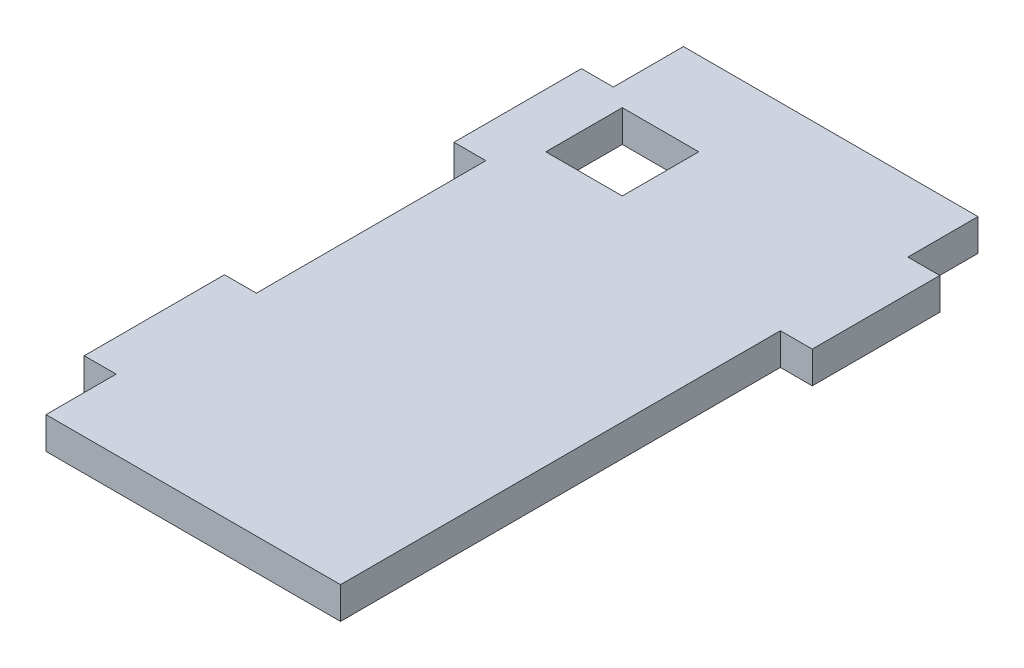
ISO-10303-21;
HEADER;
FILE_DESCRIPTION(('STEP AP214'),'2;1');
FILE_NAME('part.step','',(''),(''),'','','');
FILE_SCHEMA(('AUTOMOTIVE_DESIGN { 1 0 10303 214 1 1 1 1 }'));
ENDSEC;
DATA;
#1=APPLICATION_CONTEXT('core data for automotive mechanical design processes');
#2=APPLICATION_PROTOCOL_DEFINITION('international standard','automotive_design',2000,#1);
#3=PRODUCT_CONTEXT('',#1,'mechanical');
#4=PRODUCT('Part','Part','',(#3));
#5=PRODUCT_RELATED_PRODUCT_CATEGORY('part','',(#4));
#6=PRODUCT_DEFINITION_FORMATION('','',#4);
#7=PRODUCT_DEFINITION_CONTEXT('part definition',#1,'design');
#8=PRODUCT_DEFINITION('design','',#6,#7);
#9=PRODUCT_DEFINITION_SHAPE('','',#8);
#10=(LENGTH_UNIT() NAMED_UNIT(*) SI_UNIT(.MILLI.,.METRE.));
#11=(NAMED_UNIT(*) PLANE_ANGLE_UNIT() SI_UNIT($,.RADIAN.));
#12=(NAMED_UNIT(*) SI_UNIT($,.STERADIAN.) SOLID_ANGLE_UNIT());
#13=UNCERTAINTY_MEASURE_WITH_UNIT(LENGTH_MEASURE(1.E-05),#10,'distance_accuracy_value','');
#14=(GEOMETRIC_REPRESENTATION_CONTEXT(3) GLOBAL_UNCERTAINTY_ASSIGNED_CONTEXT((#13)) GLOBAL_UNIT_ASSIGNED_CONTEXT((#10,
#11,#12)) REPRESENTATION_CONTEXT('',''));
#15=CARTESIAN_POINT('',(0.,0.,0.));
#16=DIRECTION('',(0.,0.,1.));
#17=DIRECTION('',(1.,0.,0.));
#18=AXIS2_PLACEMENT_3D('',#15,#16,#17);
#19=CARTESIAN_POINT('',(0.,6.35,0.));
#20=DIRECTION('',(1.,0.,0.));
#21=DIRECTION('',(0.,0.,-1.));
#22=AXIS2_PLACEMENT_3D('',#19,#20,#21);
#23=PLANE('',#22);
#24=DIRECTION('',(0.,0.,1.));
#25=VECTOR('',#24,1.);
#26=CARTESIAN_POINT('',(0.,0.,0.));
#27=LINE('',#26,#25);
#28=CARTESIAN_POINT('',(0.,0.,-13.97));
#29=VERTEX_POINT('',#28);
#30=CARTESIAN_POINT('',(0.,0.,0.));
#31=VERTEX_POINT('',#30);
#32=EDGE_CURVE('E204',#29,#31,#27,.T.);
#33=ORIENTED_EDGE('',*,*,#32,.T.);
#34=DIRECTION('',(0.,-1.,0.));
#35=VECTOR('',#34,1.);
#36=CARTESIAN_POINT('',(0.,6.35,0.));
#37=LINE('',#36,#35);
#38=CARTESIAN_POINT('',(0.,6.35,0.));
#39=VERTEX_POINT('',#38);
#40=EDGE_CURVE('E11',#39,#31,#37,.T.);
#41=ORIENTED_EDGE('',*,*,#40,.F.);
#42=DIRECTION('',(0.,0.,1.));
#43=VECTOR('',#42,1.);
#44=CARTESIAN_POINT('',(0.,6.35,0.));
#45=LINE('',#44,#43);
#46=CARTESIAN_POINT('',(0.,6.35,-13.97));
#47=VERTEX_POINT('',#46);
#48=EDGE_CURVE('E208',#47,#39,#45,.T.);
#49=ORIENTED_EDGE('',*,*,#48,.F.);
#50=DIRECTION('',(0.,-1.,0.));
#51=VECTOR('',#50,1.);
#52=CARTESIAN_POINT('',(0.,6.35,-13.97));
#53=LINE('',#52,#51);
#54=EDGE_CURVE('E242',#47,#29,#53,.T.);
#55=ORIENTED_EDGE('',*,*,#54,.T.);
#56=EDGE_LOOP('',(#33,#41,#49,#55));
#57=FACE_BOUND('',#56,.T.);
#58=ADVANCED_FACE('F35',(#57),#23,.F.);
#59=CARTESIAN_POINT('',(0.,6.35,0.));
#60=DIRECTION('',(0.,0.,-1.));
#61=DIRECTION('',(-1.,0.,0.));
#62=AXIS2_PLACEMENT_3D('',#59,#60,#61);
#63=PLANE('',#62);
#64=DIRECTION('',(1.,0.,0.));
#65=VECTOR('',#64,1.);
#66=CARTESIAN_POINT('',(0.,0.,0.));
#67=LINE('',#66,#65);
#68=CARTESIAN_POINT('',(58.674,0.,0.));
#69=VERTEX_POINT('',#68);
#70=EDGE_CURVE('E245',#31,#69,#67,.T.);
#71=ORIENTED_EDGE('',*,*,#70,.T.);
#72=DIRECTION('',(0.,-1.,0.));
#73=VECTOR('',#72,1.);
#74=CARTESIAN_POINT('',(58.674,6.35,0.));
#75=LINE('',#74,#73);
#76=CARTESIAN_POINT('',(58.674,6.35,0.));
#77=VERTEX_POINT('',#76);
#78=EDGE_CURVE('E42',#77,#69,#75,.T.);
#79=ORIENTED_EDGE('',*,*,#78,.F.);
#80=DIRECTION('',(1.,0.,0.));
#81=VECTOR('',#80,1.);
#82=CARTESIAN_POINT('',(0.,6.35,0.));
#83=LINE('',#82,#81);
#84=EDGE_CURVE('E211',#39,#77,#83,.T.);
#85=ORIENTED_EDGE('',*,*,#84,.F.);
#86=ORIENTED_EDGE('',*,*,#40,.T.);
#87=EDGE_LOOP('',(#71,#79,#85,#86));
#88=FACE_BOUND('',#87,.T.);
#89=ADVANCED_FACE('F340',(#88),#63,.F.);
#90=CARTESIAN_POINT('',(58.674,6.35,0.));
#91=DIRECTION('',(-1.,0.,0.));
#92=DIRECTION('',(0.,0.,1.));
#93=AXIS2_PLACEMENT_3D('',#90,#91,#92);
#94=PLANE('',#93);
#95=DIRECTION('',(0.,0.,-1.));
#96=VECTOR('',#95,1.);
#97=CARTESIAN_POINT('',(58.674,0.,0.));
#98=LINE('',#97,#96);
#99=CARTESIAN_POINT('',(58.674,0.,-87.63));
#100=VERTEX_POINT('',#99);
#101=EDGE_CURVE('E247',#69,#100,#98,.T.);
#102=ORIENTED_EDGE('',*,*,#101,.T.);
#103=DIRECTION('',(0.,-1.,0.));
#104=VECTOR('',#103,1.);
#105=CARTESIAN_POINT('',(58.674,6.35,-87.63));
#106=LINE('',#105,#104);
#107=CARTESIAN_POINT('',(58.674,6.35,-87.63));
#108=VERTEX_POINT('',#107);
#109=EDGE_CURVE('E312',#108,#100,#106,.T.);
#110=ORIENTED_EDGE('',*,*,#109,.F.);
#111=DIRECTION('',(0.,0.,-1.));
#112=VECTOR('',#111,1.);
#113=CARTESIAN_POINT('',(58.674,6.35,0.));
#114=LINE('',#113,#112);
#115=EDGE_CURVE('E214',#77,#108,#114,.T.);
#116=ORIENTED_EDGE('',*,*,#115,.F.);
#117=ORIENTED_EDGE('',*,*,#78,.T.);
#118=EDGE_LOOP('',(#102,#110,#116,#117));
#119=FACE_BOUND('',#118,.T.);
#120=ADVANCED_FACE('F319',(#119),#94,.F.);
#121=CARTESIAN_POINT('',(58.674,6.35,-87.63));
#122=DIRECTION('',(0.,0.,-1.));
#123=DIRECTION('',(-1.,0.,0.));
#124=AXIS2_PLACEMENT_3D('',#121,#122,#123);
#125=PLANE('',#124);
#126=DIRECTION('',(1.,0.,0.));
#127=VECTOR('',#126,1.);
#128=CARTESIAN_POINT('',(58.674,0.,-87.63));
#129=LINE('',#128,#127);
#130=CARTESIAN_POINT('',(65.024,0.,-87.63));
#131=VERTEX_POINT('',#130);
#132=EDGE_CURVE('E249',#100,#131,#129,.T.);
#133=ORIENTED_EDGE('',*,*,#132,.T.);
#134=DIRECTION('',(0.,-1.,0.));
#135=VECTOR('',#134,1.);
#136=CARTESIAN_POINT('',(65.024,6.35,-87.63));
#137=LINE('',#136,#135);
#138=CARTESIAN_POINT('',(65.024,6.35,-87.63));
#139=VERTEX_POINT('',#138);
#140=EDGE_CURVE('E309',#139,#131,#137,.T.);
#141=ORIENTED_EDGE('',*,*,#140,.F.);
#142=DIRECTION('',(1.,0.,0.));
#143=VECTOR('',#142,1.);
#144=CARTESIAN_POINT('',(58.674,6.35,-87.63));
#145=LINE('',#144,#143);
#146=EDGE_CURVE('E216',#108,#139,#145,.T.);
#147=ORIENTED_EDGE('',*,*,#146,.F.);
#148=ORIENTED_EDGE('',*,*,#109,.T.);
#149=EDGE_LOOP('',(#133,#141,#147,#148));
#150=FACE_BOUND('',#149,.T.);
#151=ADVANCED_FACE('F328',(#150),#125,.F.);
#152=CARTESIAN_POINT('',(65.024,6.35,-113.03));
#153=DIRECTION('',(-1.,0.,0.));
#154=DIRECTION('',(0.,0.,1.));
#155=AXIS2_PLACEMENT_3D('',#152,#153,#154);
#156=PLANE('',#155);
#157=DIRECTION('',(0.,0.,-1.));
#158=VECTOR('',#157,1.);
#159=CARTESIAN_POINT('',(65.024,0.,-113.03));
#160=LINE('',#159,#158);
#161=CARTESIAN_POINT('',(65.024,0.,-113.03));
#162=VERTEX_POINT('',#161);
#163=EDGE_CURVE('E251',#131,#162,#160,.T.);
#164=ORIENTED_EDGE('',*,*,#163,.T.);
#165=DIRECTION('',(0.,-1.,0.));
#166=VECTOR('',#165,1.);
#167=CARTESIAN_POINT('',(65.024,6.35,-113.03));
#168=LINE('',#167,#166);
#169=CARTESIAN_POINT('',(65.024,6.35,-113.03));
#170=VERTEX_POINT('',#169);
#171=EDGE_CURVE('E306',#170,#162,#168,.T.);
#172=ORIENTED_EDGE('',*,*,#171,.F.);
#173=DIRECTION('',(0.,0.,-1.));
#174=VECTOR('',#173,1.);
#175=CARTESIAN_POINT('',(65.024,6.35,-113.03));
#176=LINE('',#175,#174);
#177=EDGE_CURVE('E218',#139,#170,#176,.T.);
#178=ORIENTED_EDGE('',*,*,#177,.F.);
#179=ORIENTED_EDGE('',*,*,#140,.T.);
#180=EDGE_LOOP('',(#164,#172,#178,#179));
#181=FACE_BOUND('',#180,.T.);
#182=ADVANCED_FACE('F332',(#181),#156,.F.);
#183=CARTESIAN_POINT('',(58.674,6.35,-113.03));
#184=DIRECTION('',(0.,0.,1.));
#185=DIRECTION('',(1.,0.,0.));
#186=AXIS2_PLACEMENT_3D('',#183,#184,#185);
#187=PLANE('',#186);
#188=DIRECTION('',(-1.,0.,0.));
#189=VECTOR('',#188,1.);
#190=CARTESIAN_POINT('',(58.674,0.,-113.03));
#191=LINE('',#190,#189);
#192=CARTESIAN_POINT('',(58.674,0.,-113.03));
#193=VERTEX_POINT('',#192);
#194=EDGE_CURVE('E253',#162,#193,#191,.T.);
#195=ORIENTED_EDGE('',*,*,#194,.T.);
#196=DIRECTION('',(0.,-1.,0.));
#197=VECTOR('',#196,1.);
#198=CARTESIAN_POINT('',(58.674,6.35,-113.03));
#199=LINE('',#198,#197);
#200=CARTESIAN_POINT('',(58.674,6.35,-113.03));
#201=VERTEX_POINT('',#200);
#202=EDGE_CURVE('E303',#201,#193,#199,.T.);
#203=ORIENTED_EDGE('',*,*,#202,.F.);
#204=DIRECTION('',(-1.,0.,0.));
#205=VECTOR('',#204,1.);
#206=CARTESIAN_POINT('',(58.674,6.35,-113.03));
#207=LINE('',#206,#205);
#208=EDGE_CURVE('E220',#170,#201,#207,.T.);
#209=ORIENTED_EDGE('',*,*,#208,.F.);
#210=ORIENTED_EDGE('',*,*,#171,.T.);
#211=EDGE_LOOP('',(#195,#203,#209,#210));
#212=FACE_BOUND('',#211,.T.);
#213=ADVANCED_FACE('F393',(#212),#187,.F.);
#214=CARTESIAN_POINT('',(58.674,6.35,-113.03));
#215=DIRECTION('',(-1.,0.,0.));
#216=DIRECTION('',(0.,0.,1.));
#217=AXIS2_PLACEMENT_3D('',#214,#215,#216);
#218=PLANE('',#217);
#219=DIRECTION('',(0.,0.,-1.));
#220=VECTOR('',#219,1.);
#221=CARTESIAN_POINT('',(58.674,0.,-113.03));
#222=LINE('',#221,#220);
#223=CARTESIAN_POINT('',(58.674,0.,-127.));
#224=VERTEX_POINT('',#223);
#225=EDGE_CURVE('E255',#193,#224,#222,.T.);
#226=ORIENTED_EDGE('',*,*,#225,.T.);
#227=DIRECTION('',(0.,-1.,0.));
#228=VECTOR('',#227,1.);
#229=CARTESIAN_POINT('',(58.674,6.35,-127.));
#230=LINE('',#229,#228);
#231=CARTESIAN_POINT('',(58.674,6.35,-127.));
#232=VERTEX_POINT('',#231);
#233=EDGE_CURVE('E300',#232,#224,#230,.T.);
#234=ORIENTED_EDGE('',*,*,#233,.F.);
#235=DIRECTION('',(0.,0.,-1.));
#236=VECTOR('',#235,1.);
#237=CARTESIAN_POINT('',(58.674,6.35,-113.03));
#238=LINE('',#237,#236);
#239=EDGE_CURVE('E222',#201,#232,#238,.T.);
#240=ORIENTED_EDGE('',*,*,#239,.F.);
#241=ORIENTED_EDGE('',*,*,#202,.T.);
#242=EDGE_LOOP('',(#226,#234,#240,#241));
#243=FACE_BOUND('',#242,.T.);
#244=ADVANCED_FACE('F390',(#243),#218,.F.);
#245=CARTESIAN_POINT('',(0.,6.35,-127.));
#246=DIRECTION('',(0.,0.,1.));
#247=DIRECTION('',(1.,0.,0.));
#248=AXIS2_PLACEMENT_3D('',#245,#246,#247);
#249=PLANE('',#248);
#250=DIRECTION('',(-1.,0.,0.));
#251=VECTOR('',#250,1.);
#252=CARTESIAN_POINT('',(0.,0.,-127.));
#253=LINE('',#252,#251);
#254=CARTESIAN_POINT('',(0.,0.,-127.));
#255=VERTEX_POINT('',#254);
#256=EDGE_CURVE('E257',#224,#255,#253,.T.);
#257=ORIENTED_EDGE('',*,*,#256,.T.);
#258=DIRECTION('',(0.,-1.,0.));
#259=VECTOR('',#258,1.);
#260=CARTESIAN_POINT('',(0.,6.35,-127.));
#261=LINE('',#260,#259);
#262=CARTESIAN_POINT('',(0.,6.35,-127.));
#263=VERTEX_POINT('',#262);
#264=EDGE_CURVE('E297',#263,#255,#261,.T.);
#265=ORIENTED_EDGE('',*,*,#264,.F.);
#266=DIRECTION('',(-1.,0.,0.));
#267=VECTOR('',#266,1.);
#268=CARTESIAN_POINT('',(0.,6.35,-127.));
#269=LINE('',#268,#267);
#270=EDGE_CURVE('E224',#232,#263,#269,.T.);
#271=ORIENTED_EDGE('',*,*,#270,.F.);
#272=ORIENTED_EDGE('',*,*,#233,.T.);
#273=EDGE_LOOP('',(#257,#265,#271,#272));
#274=FACE_BOUND('',#273,.T.);
#275=ADVANCED_FACE('F386',(#274),#249,.F.);
#276=CARTESIAN_POINT('',(0.,6.35,-113.03));
#277=DIRECTION('',(1.,0.,0.));
#278=DIRECTION('',(0.,0.,-1.));
#279=AXIS2_PLACEMENT_3D('',#276,#277,#278);
#280=PLANE('',#279);
#281=DIRECTION('',(0.,0.,1.));
#282=VECTOR('',#281,1.);
#283=CARTESIAN_POINT('',(0.,0.,-113.03));
#284=LINE('',#283,#282);
#285=CARTESIAN_POINT('',(0.,0.,-113.03));
#286=VERTEX_POINT('',#285);
#287=EDGE_CURVE('E259',#255,#286,#284,.T.);
#288=ORIENTED_EDGE('',*,*,#287,.T.);
#289=DIRECTION('',(0.,-1.,0.));
#290=VECTOR('',#289,1.);
#291=CARTESIAN_POINT('',(0.,6.35,-113.03));
#292=LINE('',#291,#290);
#293=CARTESIAN_POINT('',(0.,6.35,-113.03));
#294=VERTEX_POINT('',#293);
#295=EDGE_CURVE('E294',#294,#286,#292,.T.);
#296=ORIENTED_EDGE('',*,*,#295,.F.);
#297=DIRECTION('',(0.,0.,1.));
#298=VECTOR('',#297,1.);
#299=CARTESIAN_POINT('',(0.,6.35,-113.03));
#300=LINE('',#299,#298);
#301=EDGE_CURVE('E226',#263,#294,#300,.T.);
#302=ORIENTED_EDGE('',*,*,#301,.F.);
#303=ORIENTED_EDGE('',*,*,#264,.T.);
#304=EDGE_LOOP('',(#288,#296,#302,#303));
#305=FACE_BOUND('',#304,.T.);
#306=ADVANCED_FACE('F382',(#305),#280,.F.);
#307=CARTESIAN_POINT('',(0.,6.35,-113.03));
#308=DIRECTION('',(0.,0.,1.));
#309=DIRECTION('',(1.,0.,0.));
#310=AXIS2_PLACEMENT_3D('',#307,#308,#309);
#311=PLANE('',#310);
#312=DIRECTION('',(-1.,0.,0.));
#313=VECTOR('',#312,1.);
#314=CARTESIAN_POINT('',(0.,0.,-113.03));
#315=LINE('',#314,#313);
#316=CARTESIAN_POINT('',(-6.35,0.,-113.03));
#317=VERTEX_POINT('',#316);
#318=EDGE_CURVE('E261',#286,#317,#315,.T.);
#319=ORIENTED_EDGE('',*,*,#318,.T.);
#320=DIRECTION('',(0.,-1.,0.));
#321=VECTOR('',#320,1.);
#322=CARTESIAN_POINT('',(-6.35,6.35,-113.03));
#323=LINE('',#322,#321);
#324=CARTESIAN_POINT('',(-6.35,6.35,-113.03));
#325=VERTEX_POINT('',#324);
#326=EDGE_CURVE('E291',#325,#317,#323,.T.);
#327=ORIENTED_EDGE('',*,*,#326,.F.);
#328=DIRECTION('',(-1.,0.,0.));
#329=VECTOR('',#328,1.);
#330=CARTESIAN_POINT('',(0.,6.35,-113.03));
#331=LINE('',#330,#329);
#332=EDGE_CURVE('E228',#294,#325,#331,.T.);
#333=ORIENTED_EDGE('',*,*,#332,.F.);
#334=ORIENTED_EDGE('',*,*,#295,.T.);
#335=EDGE_LOOP('',(#319,#327,#333,#334));
#336=FACE_BOUND('',#335,.T.);
#337=ADVANCED_FACE('F377',(#336),#311,.F.);
#338=CARTESIAN_POINT('',(-6.35,6.35,-113.03));
#339=DIRECTION('',(1.,0.,0.));
#340=DIRECTION('',(0.,0.,-1.));
#341=AXIS2_PLACEMENT_3D('',#338,#339,#340);
#342=PLANE('',#341);
#343=DIRECTION('',(0.,0.,1.));
#344=VECTOR('',#343,1.);
#345=CARTESIAN_POINT('',(-6.35,0.,-113.03));
#346=LINE('',#345,#344);
#347=CARTESIAN_POINT('',(-6.35,0.,-87.63));
#348=VERTEX_POINT('',#347);
#349=EDGE_CURVE('E263',#317,#348,#346,.T.);
#350=ORIENTED_EDGE('',*,*,#349,.T.);
#351=DIRECTION('',(0.,-1.,0.));
#352=VECTOR('',#351,1.);
#353=CARTESIAN_POINT('',(-6.35,6.35,-87.63));
#354=LINE('',#353,#352);
#355=CARTESIAN_POINT('',(-6.35,6.35,-87.63));
#356=VERTEX_POINT('',#355);
#357=EDGE_CURVE('E288',#356,#348,#354,.T.);
#358=ORIENTED_EDGE('',*,*,#357,.F.);
#359=DIRECTION('',(0.,0.,1.));
#360=VECTOR('',#359,1.);
#361=CARTESIAN_POINT('',(-6.35,6.35,-113.03));
#362=LINE('',#361,#360);
#363=EDGE_CURVE('E230',#325,#356,#362,.T.);
#364=ORIENTED_EDGE('',*,*,#363,.F.);
#365=ORIENTED_EDGE('',*,*,#326,.T.);
#366=EDGE_LOOP('',(#350,#358,#364,#365));
#367=FACE_BOUND('',#366,.T.);
#368=ADVANCED_FACE('F371',(#367),#342,.F.);
#369=CARTESIAN_POINT('',(0.,6.35,-87.63));
#370=DIRECTION('',(0.,0.,-1.));
#371=DIRECTION('',(-1.,0.,0.));
#372=AXIS2_PLACEMENT_3D('',#369,#370,#371);
#373=PLANE('',#372);
#374=DIRECTION('',(1.,0.,0.));
#375=VECTOR('',#374,1.);
#376=CARTESIAN_POINT('',(0.,0.,-87.63));
#377=LINE('',#376,#375);
#378=CARTESIAN_POINT('',(0.,0.,-87.63));
#379=VERTEX_POINT('',#378);
#380=EDGE_CURVE('E265',#348,#379,#377,.T.);
#381=ORIENTED_EDGE('',*,*,#380,.T.);
#382=DIRECTION('',(0.,-1.,0.));
#383=VECTOR('',#382,1.);
#384=CARTESIAN_POINT('',(0.,6.35,-87.63));
#385=LINE('',#384,#383);
#386=CARTESIAN_POINT('',(0.,6.35,-87.63));
#387=VERTEX_POINT('',#386);
#388=EDGE_CURVE('E285',#387,#379,#385,.T.);
#389=ORIENTED_EDGE('',*,*,#388,.F.);
#390=DIRECTION('',(1.,0.,0.));
#391=VECTOR('',#390,1.);
#392=CARTESIAN_POINT('',(0.,6.35,-87.63));
#393=LINE('',#392,#391);
#394=EDGE_CURVE('E232',#356,#387,#393,.T.);
#395=ORIENTED_EDGE('',*,*,#394,.F.);
#396=ORIENTED_EDGE('',*,*,#357,.T.);
#397=EDGE_LOOP('',(#381,#389,#395,#396));
#398=FACE_BOUND('',#397,.T.);
#399=ADVANCED_FACE('F367',(#398),#373,.F.);
#400=CARTESIAN_POINT('',(0.,6.35,-41.91));
#401=DIRECTION('',(1.,0.,0.));
#402=DIRECTION('',(0.,0.,-1.));
#403=AXIS2_PLACEMENT_3D('',#400,#401,#402);
#404=PLANE('',#403);
#405=DIRECTION('',(0.,0.,1.));
#406=VECTOR('',#405,1.);
#407=CARTESIAN_POINT('',(0.,0.,-41.91));
#408=LINE('',#407,#406);
#409=CARTESIAN_POINT('',(0.,0.,-41.91));
#410=VERTEX_POINT('',#409);
#411=EDGE_CURVE('E267',#379,#410,#408,.T.);
#412=ORIENTED_EDGE('',*,*,#411,.T.);
#413=DIRECTION('',(0.,-1.,0.));
#414=VECTOR('',#413,1.);
#415=CARTESIAN_POINT('',(0.,6.35,-41.91));
#416=LINE('',#415,#414);
#417=CARTESIAN_POINT('',(0.,6.35,-41.91));
#418=VERTEX_POINT('',#417);
#419=EDGE_CURVE('E282',#418,#410,#416,.T.);
#420=ORIENTED_EDGE('',*,*,#419,.F.);
#421=DIRECTION('',(0.,0.,1.));
#422=VECTOR('',#421,1.);
#423=CARTESIAN_POINT('',(0.,6.35,-41.91));
#424=LINE('',#423,#422);
#425=EDGE_CURVE('E234',#387,#418,#424,.T.);
#426=ORIENTED_EDGE('',*,*,#425,.F.);
#427=ORIENTED_EDGE('',*,*,#388,.T.);
#428=EDGE_LOOP('',(#412,#420,#426,#427));
#429=FACE_BOUND('',#428,.T.);
#430=ADVANCED_FACE('F362',(#429),#404,.F.);
#431=CARTESIAN_POINT('',(0.,6.35,-41.91));
#432=DIRECTION('',(0.,0.,1.));
#433=DIRECTION('',(1.,0.,0.));
#434=AXIS2_PLACEMENT_3D('',#431,#432,#433);
#435=PLANE('',#434);
#436=DIRECTION('',(-1.,0.,0.));
#437=VECTOR('',#436,1.);
#438=CARTESIAN_POINT('',(0.,0.,-41.91));
#439=LINE('',#438,#437);
#440=CARTESIAN_POINT('',(-6.35,0.,-41.91));
#441=VERTEX_POINT('',#440);
#442=EDGE_CURVE('E269',#410,#441,#439,.T.);
#443=ORIENTED_EDGE('',*,*,#442,.T.);
#444=DIRECTION('',(0.,-1.,0.));
#445=VECTOR('',#444,1.);
#446=CARTESIAN_POINT('',(-6.35,6.35,-41.91));
#447=LINE('',#446,#445);
#448=CARTESIAN_POINT('',(-6.35,6.35,-41.91));
#449=VERTEX_POINT('',#448);
#450=EDGE_CURVE('E279',#449,#441,#447,.T.);
#451=ORIENTED_EDGE('',*,*,#450,.F.);
#452=DIRECTION('',(-1.,0.,0.));
#453=VECTOR('',#452,1.);
#454=CARTESIAN_POINT('',(0.,6.35,-41.91));
#455=LINE('',#454,#453);
#456=EDGE_CURVE('E236',#418,#449,#455,.T.);
#457=ORIENTED_EDGE('',*,*,#456,.F.);
#458=ORIENTED_EDGE('',*,*,#419,.T.);
#459=EDGE_LOOP('',(#443,#451,#457,#458));
#460=FACE_BOUND('',#459,.T.);
#461=ADVANCED_FACE('F356',(#460),#435,.F.);
#462=CARTESIAN_POINT('',(-6.35,6.35,-41.91));
#463=DIRECTION('',(1.,0.,0.));
#464=DIRECTION('',(0.,0.,-1.));
#465=AXIS2_PLACEMENT_3D('',#462,#463,#464);
#466=PLANE('',#465);
#467=DIRECTION('',(0.,0.,1.));
#468=VECTOR('',#467,1.);
#469=CARTESIAN_POINT('',(-6.35,0.,-41.91));
#470=LINE('',#469,#468);
#471=CARTESIAN_POINT('',(-6.35,0.,-13.97));
#472=VERTEX_POINT('',#471);
#473=EDGE_CURVE('E271',#441,#472,#470,.T.);
#474=ORIENTED_EDGE('',*,*,#473,.T.);
#475=DIRECTION('',(0.,-1.,0.));
#476=VECTOR('',#475,1.);
#477=CARTESIAN_POINT('',(-6.35,6.35,-13.97));
#478=LINE('',#477,#476);
#479=CARTESIAN_POINT('',(-6.35,6.35,-13.97));
#480=VERTEX_POINT('',#479);
#481=EDGE_CURVE('E276',#480,#472,#478,.T.);
#482=ORIENTED_EDGE('',*,*,#481,.F.);
#483=DIRECTION('',(0.,0.,1.));
#484=VECTOR('',#483,1.);
#485=CARTESIAN_POINT('',(-6.35,6.35,-41.91));
#486=LINE('',#485,#484);
#487=EDGE_CURVE('E238',#449,#480,#486,.T.);
#488=ORIENTED_EDGE('',*,*,#487,.F.);
#489=ORIENTED_EDGE('',*,*,#450,.T.);
#490=EDGE_LOOP('',(#474,#482,#488,#489));
#491=FACE_BOUND('',#490,.T.);
#492=ADVANCED_FACE('F352',(#491),#466,.F.);
#493=CARTESIAN_POINT('',(0.,6.35,-13.97));
#494=DIRECTION('',(0.,0.,-1.));
#495=DIRECTION('',(-1.,0.,0.));
#496=AXIS2_PLACEMENT_3D('',#493,#494,#495);
#497=PLANE('',#496);
#498=DIRECTION('',(1.,0.,0.));
#499=VECTOR('',#498,1.);
#500=CARTESIAN_POINT('',(0.,0.,-13.97));
#501=LINE('',#500,#499);
#502=EDGE_CURVE('E212',#472,#29,#501,.T.);
#503=ORIENTED_EDGE('',*,*,#502,.T.);
#504=ORIENTED_EDGE('',*,*,#54,.F.);
#505=DIRECTION('',(1.,0.,0.));
#506=VECTOR('',#505,1.);
#507=CARTESIAN_POINT('',(0.,6.35,-13.97));
#508=LINE('',#507,#506);
#509=EDGE_CURVE('E240',#480,#47,#508,.T.);
#510=ORIENTED_EDGE('',*,*,#509,.F.);
#511=ORIENTED_EDGE('',*,*,#481,.T.);
#512=EDGE_LOOP('',(#503,#504,#510,#511));
#513=FACE_BOUND('',#512,.T.);
#514=ADVANCED_FACE('F347',(#513),#497,.F.);
#515=CARTESIAN_POINT('',(0.,6.35,0.));
#516=DIRECTION('',(0.,1.,0.));
#517=DIRECTION('',(0.,0.,1.));
#518=AXIS2_PLACEMENT_3D('',#515,#516,#517);
#519=PLANE('',#518);
#520=DIRECTION('',(0.,0.,1.));
#521=VECTOR('',#520,1.);
#522=CARTESIAN_POINT('',(4.445,6.35,-95.123));
#523=LINE('',#522,#521);
#524=CARTESIAN_POINT('',(4.445,6.35,-110.363));
#525=VERTEX_POINT('',#524);
#526=CARTESIAN_POINT('',(4.445,6.35,-95.123));
#527=VERTEX_POINT('',#526);
#528=EDGE_CURVE('E49',#525,#527,#523,.T.);
#529=ORIENTED_EDGE('',*,*,#528,.F.);
#530=DIRECTION('',(-1.,0.,0.));
#531=VECTOR('',#530,1.);
#532=CARTESIAN_POINT('',(4.445,6.35,-110.363));
#533=LINE('',#532,#531);
#534=CARTESIAN_POINT('',(19.685,6.35,-110.363));
#535=VERTEX_POINT('',#534);
#536=EDGE_CURVE('E189',#535,#525,#533,.T.);
#537=ORIENTED_EDGE('',*,*,#536,.F.);
#538=DIRECTION('',(0.,0.,-1.));
#539=VECTOR('',#538,1.);
#540=CARTESIAN_POINT('',(19.685,6.35,-95.123));
#541=LINE('',#540,#539);
#542=CARTESIAN_POINT('',(19.685,6.35,-95.123));
#543=VERTEX_POINT('',#542);
#544=EDGE_CURVE('E192',#543,#535,#541,.T.);
#545=ORIENTED_EDGE('',*,*,#544,.F.);
#546=DIRECTION('',(1.,0.,0.));
#547=VECTOR('',#546,1.);
#548=CARTESIAN_POINT('',(4.445,6.35,-95.123));
#549=LINE('',#548,#547);
#550=EDGE_CURVE('E198',#527,#543,#549,.T.);
#551=ORIENTED_EDGE('',*,*,#550,.F.);
#552=EDGE_LOOP('',(#529,#537,#545,#551));
#553=FACE_BOUND('',#552,.T.);
#554=ORIENTED_EDGE('',*,*,#48,.T.);
#555=ORIENTED_EDGE('',*,*,#84,.T.);
#556=ORIENTED_EDGE('',*,*,#115,.T.);
#557=ORIENTED_EDGE('',*,*,#146,.T.);
#558=ORIENTED_EDGE('',*,*,#177,.T.);
#559=ORIENTED_EDGE('',*,*,#208,.T.);
#560=ORIENTED_EDGE('',*,*,#239,.T.);
#561=ORIENTED_EDGE('',*,*,#270,.T.);
#562=ORIENTED_EDGE('',*,*,#301,.T.);
#563=ORIENTED_EDGE('',*,*,#332,.T.);
#564=ORIENTED_EDGE('',*,*,#363,.T.);
#565=ORIENTED_EDGE('',*,*,#394,.T.);
#566=ORIENTED_EDGE('',*,*,#425,.T.);
#567=ORIENTED_EDGE('',*,*,#456,.T.);
#568=ORIENTED_EDGE('',*,*,#487,.T.);
#569=ORIENTED_EDGE('',*,*,#509,.T.);
#570=EDGE_LOOP('',(#554,#555,#556,#557,#558,#559,#560,#561,#562,#563,#564,#565,#566,#567,#568,#569));
#571=FACE_BOUND('',#570,.T.);
#572=ADVANCED_FACE('F336',(#553,#571),#519,.T.);
#573=CARTESIAN_POINT('',(0.,0.,0.));
#574=DIRECTION('',(0.,1.,0.));
#575=DIRECTION('',(0.,0.,1.));
#576=AXIS2_PLACEMENT_3D('',#573,#574,#575);
#577=PLANE('',#576);
#578=DIRECTION('',(-1.,0.,0.));
#579=VECTOR('',#578,1.);
#580=CARTESIAN_POINT('',(4.445,0.,-110.363));
#581=LINE('',#580,#579);
#582=CARTESIAN_POINT('',(19.685,0.,-110.363));
#583=VERTEX_POINT('',#582);
#584=CARTESIAN_POINT('',(4.445,0.,-110.363));
#585=VERTEX_POINT('',#584);
#586=EDGE_CURVE('E179',#583,#585,#581,.T.);
#587=ORIENTED_EDGE('',*,*,#586,.T.);
#588=DIRECTION('',(0.,0.,1.));
#589=VECTOR('',#588,1.);
#590=CARTESIAN_POINT('',(4.445,0.,-95.123));
#591=LINE('',#590,#589);
#592=CARTESIAN_POINT('',(4.445,0.,-95.123));
#593=VERTEX_POINT('',#592);
#594=EDGE_CURVE('E173',#585,#593,#591,.T.);
#595=ORIENTED_EDGE('',*,*,#594,.T.);
#596=DIRECTION('',(1.,0.,0.));
#597=VECTOR('',#596,1.);
#598=CARTESIAN_POINT('',(4.445,0.,-95.123));
#599=LINE('',#598,#597);
#600=CARTESIAN_POINT('',(19.685,0.,-95.123));
#601=VERTEX_POINT('',#600);
#602=EDGE_CURVE('E182',#593,#601,#599,.T.);
#603=ORIENTED_EDGE('',*,*,#602,.T.);
#604=DIRECTION('',(0.,0.,-1.));
#605=VECTOR('',#604,1.);
#606=CARTESIAN_POINT('',(19.685,0.,-95.123));
#607=LINE('',#606,#605);
#608=EDGE_CURVE('E57',#601,#583,#607,.T.);
#609=ORIENTED_EDGE('',*,*,#608,.T.);
#610=EDGE_LOOP('',(#587,#595,#603,#609));
#611=FACE_BOUND('',#610,.T.);
#612=ORIENTED_EDGE('',*,*,#32,.F.);
#613=ORIENTED_EDGE('',*,*,#502,.F.);
#614=ORIENTED_EDGE('',*,*,#473,.F.);
#615=ORIENTED_EDGE('',*,*,#442,.F.);
#616=ORIENTED_EDGE('',*,*,#411,.F.);
#617=ORIENTED_EDGE('',*,*,#380,.F.);
#618=ORIENTED_EDGE('',*,*,#349,.F.);
#619=ORIENTED_EDGE('',*,*,#318,.F.);
#620=ORIENTED_EDGE('',*,*,#287,.F.);
#621=ORIENTED_EDGE('',*,*,#256,.F.);
#622=ORIENTED_EDGE('',*,*,#225,.F.);
#623=ORIENTED_EDGE('',*,*,#194,.F.);
#624=ORIENTED_EDGE('',*,*,#163,.F.);
#625=ORIENTED_EDGE('',*,*,#132,.F.);
#626=ORIENTED_EDGE('',*,*,#101,.F.);
#627=ORIENTED_EDGE('',*,*,#70,.F.);
#628=EDGE_LOOP('',(#612,#613,#614,#615,#616,#617,#618,#619,#620,#621,#622,#623,#624,#625,#626,#627));
#629=FACE_BOUND('',#628,.T.);
#630=ADVANCED_FACE('F186',(#611,#629),#577,.F.);
#631=CARTESIAN_POINT('',(4.445,0.,-95.123));
#632=DIRECTION('',(-1.,0.,0.));
#633=DIRECTION('',(0.,0.,1.));
#634=AXIS2_PLACEMENT_3D('',#631,#632,#633);
#635=PLANE('',#634);
#636=ORIENTED_EDGE('',*,*,#528,.T.);
#637=DIRECTION('',(0.,1.,0.));
#638=VECTOR('',#637,1.);
#639=CARTESIAN_POINT('',(4.445,0.,-95.123));
#640=LINE('',#639,#638);
#641=EDGE_CURVE('E169',#593,#527,#640,.T.);
#642=ORIENTED_EDGE('',*,*,#641,.F.);
#643=ORIENTED_EDGE('',*,*,#594,.F.);
#644=DIRECTION('',(0.,1.,0.));
#645=VECTOR('',#644,1.);
#646=CARTESIAN_POINT('',(4.445,0.,-110.363));
#647=LINE('',#646,#645);
#648=EDGE_CURVE('E202',#585,#525,#647,.T.);
#649=ORIENTED_EDGE('',*,*,#648,.T.);
#650=EDGE_LOOP('',(#636,#642,#643,#649));
#651=FACE_BOUND('',#650,.T.);
#652=ADVANCED_FACE('F171',(#651),#635,.F.);
#653=CARTESIAN_POINT('',(4.445,0.,-110.363));
#654=DIRECTION('',(0.,0.,-1.));
#655=DIRECTION('',(-1.,0.,0.));
#656=AXIS2_PLACEMENT_3D('',#653,#654,#655);
#657=PLANE('',#656);
#658=ORIENTED_EDGE('',*,*,#536,.T.);
#659=ORIENTED_EDGE('',*,*,#648,.F.);
#660=ORIENTED_EDGE('',*,*,#586,.F.);
#661=DIRECTION('',(0.,1.,0.));
#662=VECTOR('',#661,1.);
#663=CARTESIAN_POINT('',(19.685,0.,-110.363));
#664=LINE('',#663,#662);
#665=EDGE_CURVE('E205',#583,#535,#664,.T.);
#666=ORIENTED_EDGE('',*,*,#665,.T.);
#667=EDGE_LOOP('',(#658,#659,#660,#666));
#668=FACE_BOUND('',#667,.T.);
#669=ADVANCED_FACE('F526',(#668),#657,.F.);
#670=CARTESIAN_POINT('',(19.685,0.,-95.123));
#671=DIRECTION('',(1.,0.,0.));
#672=DIRECTION('',(0.,0.,-1.));
#673=AXIS2_PLACEMENT_3D('',#670,#671,#672);
#674=PLANE('',#673);
#675=ORIENTED_EDGE('',*,*,#544,.T.);
#676=ORIENTED_EDGE('',*,*,#665,.F.);
#677=ORIENTED_EDGE('',*,*,#608,.F.);
#678=DIRECTION('',(0.,1.,0.));
#679=VECTOR('',#678,1.);
#680=CARTESIAN_POINT('',(19.685,0.,-95.123));
#681=LINE('',#680,#679);
#682=EDGE_CURVE('E178',#601,#543,#681,.T.);
#683=ORIENTED_EDGE('',*,*,#682,.T.);
#684=EDGE_LOOP('',(#675,#676,#677,#683));
#685=FACE_BOUND('',#684,.T.);
#686=ADVANCED_FACE('F535',(#685),#674,.F.);
#687=CARTESIAN_POINT('',(4.445,0.,-95.123));
#688=DIRECTION('',(0.,0.,1.));
#689=DIRECTION('',(1.,0.,0.));
#690=AXIS2_PLACEMENT_3D('',#687,#688,#689);
#691=PLANE('',#690);
#692=ORIENTED_EDGE('',*,*,#550,.T.);
#693=ORIENTED_EDGE('',*,*,#682,.F.);
#694=ORIENTED_EDGE('',*,*,#602,.F.);
#695=ORIENTED_EDGE('',*,*,#641,.T.);
#696=EDGE_LOOP('',(#692,#693,#694,#695));
#697=FACE_BOUND('',#696,.T.);
#698=ADVANCED_FACE('F183',(#697),#691,.F.);
#699=CLOSED_SHELL('',(#58,#89,#120,#151,#182,#213,#244,#275,#306,#337,#368,#399,#430,#461,#492,
#514,#572,#630,#652,#669,#686,#698));
#700=MANIFOLD_SOLID_BREP('B2',#699);
#701=ADVANCED_BREP_SHAPE_REPRESENTATION('',(#18,#700),#14);
#702=SHAPE_DEFINITION_REPRESENTATION(#9,#701);
ENDSEC;
END-ISO-10303-21;
